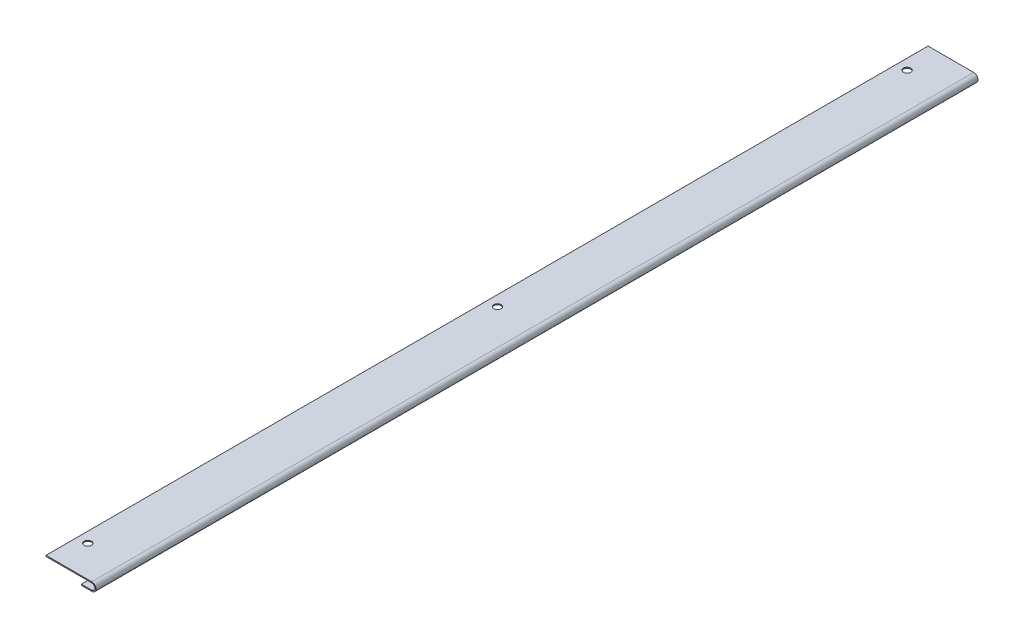
ISO-10303-21;
HEADER;
FILE_DESCRIPTION(('STEP AP214'),'2;1');
FILE_NAME('part.step','',(''),(''),'','','');
FILE_SCHEMA(('AUTOMOTIVE_DESIGN { 1 0 10303 214 1 1 1 1 }'));
ENDSEC;
DATA;
#1=APPLICATION_CONTEXT('core data for automotive mechanical design processes');
#2=APPLICATION_PROTOCOL_DEFINITION('international standard','automotive_design',2000,#1);
#3=PRODUCT_CONTEXT('',#1,'mechanical');
#4=PRODUCT('Part','Part','',(#3));
#5=PRODUCT_RELATED_PRODUCT_CATEGORY('part','',(#4));
#6=PRODUCT_DEFINITION_FORMATION('','',#4);
#7=PRODUCT_DEFINITION_CONTEXT('part definition',#1,'design');
#8=PRODUCT_DEFINITION('design','',#6,#7);
#9=PRODUCT_DEFINITION_SHAPE('','',#8);
#10=(LENGTH_UNIT() NAMED_UNIT(*) SI_UNIT(.MILLI.,.METRE.));
#11=(NAMED_UNIT(*) PLANE_ANGLE_UNIT() SI_UNIT($,.RADIAN.));
#12=(NAMED_UNIT(*) SI_UNIT($,.STERADIAN.) SOLID_ANGLE_UNIT());
#13=UNCERTAINTY_MEASURE_WITH_UNIT(LENGTH_MEASURE(1.E-05),#10,'distance_accuracy_value','');
#14=(GEOMETRIC_REPRESENTATION_CONTEXT(3) GLOBAL_UNCERTAINTY_ASSIGNED_CONTEXT((#13)) GLOBAL_UNIT_ASSIGNED_CONTEXT((#10,
#11,#12)) REPRESENTATION_CONTEXT('',''));
#15=CARTESIAN_POINT('',(0.,0.,0.));
#16=DIRECTION('',(0.,0.,1.));
#17=DIRECTION('',(1.,0.,0.));
#18=AXIS2_PLACEMENT_3D('',#15,#16,#17);
#19=CARTESIAN_POINT('',(21.9,-4.,211.));
#20=DIRECTION('',(0.,0.,1.));
#21=DIRECTION('',(1.,0.,0.));
#22=AXIS2_PLACEMENT_3D('',#19,#20,#21);
#23=PLANE('',#22);
#24=DIRECTION('',(0.,1.,0.));
#25=VECTOR('',#24,1.);
#26=CARTESIAN_POINT('',(21.9,-4.,211.));
#27=LINE('',#26,#25);
#28=CARTESIAN_POINT('',(21.9,-4.,211.));
#29=VERTEX_POINT('',#28);
#30=CARTESIAN_POINT('',(21.9,-3.5,211.));
#31=VERTEX_POINT('',#30);
#32=EDGE_CURVE('E11',#29,#31,#27,.T.);
#33=ORIENTED_EDGE('',*,*,#32,.F.);
#34=CARTESIAN_POINT('',(21.9,-2.,211.));
#35=DIRECTION('',(0.,0.,-1.));
#36=DIRECTION('',(-1.,0.,0.));
#37=AXIS2_PLACEMENT_3D('',#34,#35,#36);
#38=CIRCLE('',#37,2.);
#39=CARTESIAN_POINT('',(21.9,0.,211.));
#40=VERTEX_POINT('',#39);
#41=EDGE_CURVE('E137',#40,#29,#38,.T.);
#42=ORIENTED_EDGE('',*,*,#41,.F.);
#43=DIRECTION('',(0.,1.,0.));
#44=VECTOR('',#43,1.);
#45=CARTESIAN_POINT('',(21.9,-0.5,211.));
#46=LINE('',#45,#44);
#47=CARTESIAN_POINT('',(21.9,-0.5,211.));
#48=VERTEX_POINT('',#47);
#49=EDGE_CURVE('E47',#48,#40,#46,.T.);
#50=ORIENTED_EDGE('',*,*,#49,.F.);
#51=CARTESIAN_POINT('',(21.9,-2.,211.));
#52=DIRECTION('',(0.,0.,1.));
#53=DIRECTION('',(1.,0.,0.));
#54=AXIS2_PLACEMENT_3D('',#51,#52,#53);
#55=CIRCLE('',#54,1.5);
#56=EDGE_CURVE('E130',#48,#31,#55,.F.);
#57=ORIENTED_EDGE('',*,*,#56,.T.);
#58=EDGE_LOOP('',(#33,#42,#50,#57));
#59=FACE_BOUND('',#58,.T.);
#60=ADVANCED_FACE('F38',(#59),#23,.T.);
#61=CARTESIAN_POINT('',(21.9,-0.5,211.));
#62=DIRECTION('',(0.,0.,1.));
#63=DIRECTION('',(1.,0.,0.));
#64=AXIS2_PLACEMENT_3D('',#61,#62,#63);
#65=PLANE('',#64);
#66=DIRECTION('',(-1.,0.,0.));
#67=VECTOR('',#66,1.);
#68=CARTESIAN_POINT('',(21.9,-4.,211.));
#69=LINE('',#68,#67);
#70=CARTESIAN_POINT('',(16.9,-4.,211.));
#71=VERTEX_POINT('',#70);
#72=EDGE_CURVE('E200',#29,#71,#69,.T.);
#73=ORIENTED_EDGE('',*,*,#72,.F.);
#74=ORIENTED_EDGE('',*,*,#32,.T.);
#75=DIRECTION('',(-1.,0.,0.));
#76=VECTOR('',#75,1.);
#77=CARTESIAN_POINT('',(21.9,-3.5,211.));
#78=LINE('',#77,#76);
#79=CARTESIAN_POINT('',(16.9,-3.5,211.));
#80=VERTEX_POINT('',#79);
#81=EDGE_CURVE('E96',#31,#80,#78,.T.);
#82=ORIENTED_EDGE('',*,*,#81,.T.);
#83=DIRECTION('',(0.,1.,0.));
#84=VECTOR('',#83,1.);
#85=CARTESIAN_POINT('',(16.9,-4.,211.));
#86=LINE('',#85,#84);
#87=EDGE_CURVE('E197',#71,#80,#86,.T.);
#88=ORIENTED_EDGE('',*,*,#87,.F.);
#89=EDGE_LOOP('',(#73,#74,#82,#88));
#90=FACE_BOUND('',#89,.T.);
#91=ADVANCED_FACE('F220',(#90),#65,.T.);
#92=CARTESIAN_POINT('',(21.9,0.,-211.));
#93=DIRECTION('',(0.,0.,-1.));
#94=DIRECTION('',(-1.,0.,0.));
#95=AXIS2_PLACEMENT_3D('',#92,#93,#94);
#96=PLANE('',#95);
#97=DIRECTION('',(0.,-1.,0.));
#98=VECTOR('',#97,1.);
#99=CARTESIAN_POINT('',(21.9,0.,-211.));
#100=LINE('',#99,#98);
#101=CARTESIAN_POINT('',(21.9,0.,-211.));
#102=VERTEX_POINT('',#101);
#103=CARTESIAN_POINT('',(21.9,-0.5,-211.));
#104=VERTEX_POINT('',#103);
#105=EDGE_CURVE('E83',#102,#104,#100,.T.);
#106=ORIENTED_EDGE('',*,*,#105,.F.);
#107=CARTESIAN_POINT('',(21.9,-2.,-211.));
#108=DIRECTION('',(0.,0.,-1.));
#109=DIRECTION('',(-1.,0.,0.));
#110=AXIS2_PLACEMENT_3D('',#107,#108,#109);
#111=CIRCLE('',#110,2.);
#112=CARTESIAN_POINT('',(21.9,-4.,-211.));
#113=VERTEX_POINT('',#112);
#114=EDGE_CURVE('E153',#102,#113,#111,.T.);
#115=ORIENTED_EDGE('',*,*,#114,.T.);
#116=DIRECTION('',(0.,-1.,0.));
#117=VECTOR('',#116,1.);
#118=CARTESIAN_POINT('',(21.9,-3.5,-211.));
#119=LINE('',#118,#117);
#120=CARTESIAN_POINT('',(21.9,-3.5,-211.));
#121=VERTEX_POINT('',#120);
#122=EDGE_CURVE('E90',#121,#113,#119,.T.);
#123=ORIENTED_EDGE('',*,*,#122,.F.);
#124=CARTESIAN_POINT('',(21.9,-2.,-211.));
#125=DIRECTION('',(0.,0.,1.));
#126=DIRECTION('',(1.,0.,0.));
#127=AXIS2_PLACEMENT_3D('',#124,#125,#126);
#128=CIRCLE('',#127,1.5);
#129=EDGE_CURVE('E160',#104,#121,#128,.F.);
#130=ORIENTED_EDGE('',*,*,#129,.F.);
#131=EDGE_LOOP('',(#106,#115,#123,#130));
#132=FACE_BOUND('',#131,.T.);
#133=ADVANCED_FACE('F218',(#132),#96,.T.);
#134=CARTESIAN_POINT('',(21.9,-3.5,-211.));
#135=DIRECTION('',(0.,0.,-1.));
#136=DIRECTION('',(-1.,0.,0.));
#137=AXIS2_PLACEMENT_3D('',#134,#135,#136);
#138=PLANE('',#137);
#139=DIRECTION('',(1.,0.,0.));
#140=VECTOR('',#139,1.);
#141=CARTESIAN_POINT('',(0.,0.,-211.));
#142=LINE('',#141,#140);
#143=CARTESIAN_POINT('',(0.,0.,-211.));
#144=VERTEX_POINT('',#143);
#145=EDGE_CURVE('E155',#144,#102,#142,.T.);
#146=ORIENTED_EDGE('',*,*,#145,.T.);
#147=ORIENTED_EDGE('',*,*,#105,.T.);
#148=DIRECTION('',(1.,0.,0.));
#149=VECTOR('',#148,1.);
#150=CARTESIAN_POINT('',(0.,-0.5,-211.));
#151=LINE('',#150,#149);
#152=CARTESIAN_POINT('',(0.,-0.5,-211.));
#153=VERTEX_POINT('',#152);
#154=EDGE_CURVE('E158',#153,#104,#151,.T.);
#155=ORIENTED_EDGE('',*,*,#154,.F.);
#156=DIRECTION('',(0.,1.,0.));
#157=VECTOR('',#156,1.);
#158=CARTESIAN_POINT('',(0.,-0.5,-211.));
#159=LINE('',#158,#157);
#160=EDGE_CURVE('E118',#153,#144,#159,.T.);
#161=ORIENTED_EDGE('',*,*,#160,.T.);
#162=EDGE_LOOP('',(#146,#147,#155,#161));
#163=FACE_BOUND('',#162,.T.);
#164=ADVANCED_FACE('F214',(#163),#138,.T.);
#165=CARTESIAN_POINT('',(21.9,-3.5,211.));
#166=DIRECTION('',(0.,-1.,0.));
#167=DIRECTION('',(1.,0.,0.));
#168=AXIS2_PLACEMENT_3D('',#165,#166,#167);
#169=PLANE('',#168);
#170=DIRECTION('',(-1.,0.,0.));
#171=VECTOR('',#170,1.);
#172=CARTESIAN_POINT('',(21.9,-3.5,-211.));
#173=LINE('',#172,#171);
#174=CARTESIAN_POINT('',(16.9,-3.5,-211.));
#175=VERTEX_POINT('',#174);
#176=EDGE_CURVE('E143',#121,#175,#173,.T.);
#177=ORIENTED_EDGE('',*,*,#176,.T.);
#178=DIRECTION('',(0.,0.,-1.));
#179=VECTOR('',#178,1.);
#180=CARTESIAN_POINT('',(16.9,-3.5,211.));
#181=LINE('',#180,#179);
#182=EDGE_CURVE('E174',#80,#175,#181,.T.);
#183=ORIENTED_EDGE('',*,*,#182,.F.);
#184=ORIENTED_EDGE('',*,*,#81,.F.);
#185=DIRECTION('',(0.,0.,-1.));
#186=VECTOR('',#185,1.);
#187=CARTESIAN_POINT('',(21.9,-3.5,211.));
#188=LINE('',#187,#186);
#189=EDGE_CURVE('E142',#31,#121,#188,.T.);
#190=ORIENTED_EDGE('',*,*,#189,.T.);
#191=EDGE_LOOP('',(#177,#183,#184,#190));
#192=FACE_BOUND('',#191,.T.);
#193=ADVANCED_FACE('F226',(#192),#169,.F.);
#194=CARTESIAN_POINT('',(16.9,-4.,211.));
#195=DIRECTION('',(-1.,0.,0.));
#196=DIRECTION('',(0.,0.,1.));
#197=AXIS2_PLACEMENT_3D('',#194,#195,#196);
#198=PLANE('',#197);
#199=DIRECTION('',(0.,1.,0.));
#200=VECTOR('',#199,1.);
#201=CARTESIAN_POINT('',(16.9,-4.,-211.));
#202=LINE('',#201,#200);
#203=CARTESIAN_POINT('',(16.9,-4.,-211.));
#204=VERTEX_POINT('',#203);
#205=EDGE_CURVE('E146',#204,#175,#202,.T.);
#206=ORIENTED_EDGE('',*,*,#205,.F.);
#207=DIRECTION('',(0.,0.,-1.));
#208=VECTOR('',#207,1.);
#209=CARTESIAN_POINT('',(16.9,-4.,211.));
#210=LINE('',#209,#208);
#211=EDGE_CURVE('E172',#71,#204,#210,.T.);
#212=ORIENTED_EDGE('',*,*,#211,.F.);
#213=ORIENTED_EDGE('',*,*,#87,.T.);
#214=ORIENTED_EDGE('',*,*,#182,.T.);
#215=EDGE_LOOP('',(#206,#212,#213,#214));
#216=FACE_BOUND('',#215,.T.);
#217=ADVANCED_FACE('F257',(#216),#198,.T.);
#218=CARTESIAN_POINT('',(21.9,-4.,211.));
#219=DIRECTION('',(0.,-1.,0.));
#220=DIRECTION('',(1.,0.,0.));
#221=AXIS2_PLACEMENT_3D('',#218,#219,#220);
#222=PLANE('',#221);
#223=DIRECTION('',(-1.,0.,0.));
#224=VECTOR('',#223,1.);
#225=CARTESIAN_POINT('',(21.9,-4.,-211.));
#226=LINE('',#225,#224);
#227=EDGE_CURVE('E150',#113,#204,#226,.T.);
#228=ORIENTED_EDGE('',*,*,#227,.F.);
#229=DIRECTION('',(0.,0.,-1.));
#230=VECTOR('',#229,1.);
#231=CARTESIAN_POINT('',(21.9,-4.,211.));
#232=LINE('',#231,#230);
#233=EDGE_CURVE('E169',#29,#113,#232,.T.);
#234=ORIENTED_EDGE('',*,*,#233,.F.);
#235=ORIENTED_EDGE('',*,*,#72,.T.);
#236=ORIENTED_EDGE('',*,*,#211,.T.);
#237=EDGE_LOOP('',(#228,#234,#235,#236));
#238=FACE_BOUND('',#237,.T.);
#239=ADVANCED_FACE('F268',(#238),#222,.T.);
#240=CARTESIAN_POINT('',(21.9,-2.,211.));
#241=DIRECTION('',(0.,0.,-1.));
#242=DIRECTION('',(-1.,0.,0.));
#243=AXIS2_PLACEMENT_3D('',#240,#241,#242);
#244=CYLINDRICAL_SURFACE('',#243,2.);
#245=ORIENTED_EDGE('',*,*,#114,.F.);
#246=DIRECTION('',(0.,0.,-1.));
#247=VECTOR('',#246,1.);
#248=CARTESIAN_POINT('',(21.9,0.,211.));
#249=LINE('',#248,#247);
#250=EDGE_CURVE('E166',#40,#102,#249,.T.);
#251=ORIENTED_EDGE('',*,*,#250,.F.);
#252=ORIENTED_EDGE('',*,*,#41,.T.);
#253=ORIENTED_EDGE('',*,*,#233,.T.);
#254=EDGE_LOOP('',(#245,#251,#252,#253));
#255=FACE_BOUND('',#254,.T.);
#256=ADVANCED_FACE('F207',(#255),#244,.T.);
#257=CARTESIAN_POINT('',(0.,0.,211.));
#258=DIRECTION('',(0.,1.,0.));
#259=DIRECTION('',(0.,0.,1.));
#260=AXIS2_PLACEMENT_3D('',#257,#258,#259);
#261=PLANE('',#260);
#262=CARTESIAN_POINT('',(5.,0.,0.));
#263=DIRECTION('',(0.,1.,0.));
#264=DIRECTION('',(0.,0.,1.));
#265=AXIS2_PLACEMENT_3D('',#262,#263,#264);
#266=CIRCLE('',#265,1.74999999999999);
#267=CARTESIAN_POINT('',(5.,0.,1.74999999999999));
#268=VERTEX_POINT('',#267);
#269=EDGE_CURVE('E193',#268,#268,#266,.T.);
#270=ORIENTED_EDGE('',*,*,#269,.F.);
#271=EDGE_LOOP('',(#270));
#272=FACE_BOUND('',#271,.T.);
#273=CARTESIAN_POINT('',(5.,0.,196.));
#274=DIRECTION('',(0.,1.,0.));
#275=DIRECTION('',(0.,0.,-1.));
#276=AXIS2_PLACEMENT_3D('',#273,#274,#275);
#277=CIRCLE('',#276,1.74999999999982);
#278=CARTESIAN_POINT('',(5.,0.,194.25));
#279=VERTEX_POINT('',#278);
#280=EDGE_CURVE('E183',#279,#279,#277,.T.);
#281=ORIENTED_EDGE('',*,*,#280,.F.);
#282=EDGE_LOOP('',(#281));
#283=FACE_BOUND('',#282,.T.);
#284=CARTESIAN_POINT('',(5.,0.,-196.));
#285=DIRECTION('',(0.,1.,0.));
#286=DIRECTION('',(0.,0.,1.));
#287=AXIS2_PLACEMENT_3D('',#284,#285,#286);
#288=CIRCLE('',#287,1.74999999999982);
#289=CARTESIAN_POINT('',(5.,0.,-194.25));
#290=VERTEX_POINT('',#289);
#291=EDGE_CURVE('E180',#290,#290,#288,.T.);
#292=ORIENTED_EDGE('',*,*,#291,.F.);
#293=EDGE_LOOP('',(#292));
#294=FACE_BOUND('',#293,.T.);
#295=ORIENTED_EDGE('',*,*,#145,.F.);
#296=DIRECTION('',(0.,0.,-1.));
#297=VECTOR('',#296,1.);
#298=CARTESIAN_POINT('',(0.,0.,211.));
#299=LINE('',#298,#297);
#300=CARTESIAN_POINT('',(0.,0.,211.));
#301=VERTEX_POINT('',#300);
#302=EDGE_CURVE('E120',#301,#144,#299,.T.);
#303=ORIENTED_EDGE('',*,*,#302,.F.);
#304=DIRECTION('',(1.,0.,0.));
#305=VECTOR('',#304,1.);
#306=CARTESIAN_POINT('',(0.,0.,211.));
#307=LINE('',#306,#305);
#308=EDGE_CURVE('E135',#301,#40,#307,.T.);
#309=ORIENTED_EDGE('',*,*,#308,.T.);
#310=ORIENTED_EDGE('',*,*,#250,.T.);
#311=EDGE_LOOP('',(#295,#303,#309,#310));
#312=FACE_BOUND('',#311,.T.);
#313=ADVANCED_FACE('F213',(#272,#283,#294,#312),#261,.T.);
#314=CARTESIAN_POINT('',(0.,-0.5,211.));
#315=DIRECTION('',(-1.,0.,0.));
#316=DIRECTION('',(0.,0.,1.));
#317=AXIS2_PLACEMENT_3D('',#314,#315,#316);
#318=PLANE('',#317);
#319=ORIENTED_EDGE('',*,*,#160,.F.);
#320=DIRECTION('',(0.,0.,-1.));
#321=VECTOR('',#320,1.);
#322=CARTESIAN_POINT('',(0.,-0.5,211.));
#323=LINE('',#322,#321);
#324=CARTESIAN_POINT('',(0.,-0.5,211.));
#325=VERTEX_POINT('',#324);
#326=EDGE_CURVE('E112',#325,#153,#323,.T.);
#327=ORIENTED_EDGE('',*,*,#326,.F.);
#328=DIRECTION('',(0.,1.,0.));
#329=VECTOR('',#328,1.);
#330=CARTESIAN_POINT('',(0.,-0.5,211.));
#331=LINE('',#330,#329);
#332=EDGE_CURVE('E116',#325,#301,#331,.T.);
#333=ORIENTED_EDGE('',*,*,#332,.T.);
#334=ORIENTED_EDGE('',*,*,#302,.T.);
#335=EDGE_LOOP('',(#319,#327,#333,#334));
#336=FACE_BOUND('',#335,.T.);
#337=ADVANCED_FACE('F114',(#336),#318,.T.);
#338=CARTESIAN_POINT('',(0.,-0.5,211.));
#339=DIRECTION('',(0.,1.,0.));
#340=DIRECTION('',(0.,0.,1.));
#341=AXIS2_PLACEMENT_3D('',#338,#339,#340);
#342=PLANE('',#341);
#343=CARTESIAN_POINT('',(5.,-0.5,0.));
#344=DIRECTION('',(0.,1.,0.));
#345=DIRECTION('',(0.,0.,1.));
#346=AXIS2_PLACEMENT_3D('',#343,#344,#345);
#347=CIRCLE('',#346,1.74999999999999);
#348=CARTESIAN_POINT('',(5.,-0.5,1.74999999999999));
#349=VERTEX_POINT('',#348);
#350=EDGE_CURVE('E41',#349,#349,#347,.T.);
#351=ORIENTED_EDGE('',*,*,#350,.T.);
#352=EDGE_LOOP('',(#351));
#353=FACE_BOUND('',#352,.T.);
#354=CARTESIAN_POINT('',(5.,-0.5,196.));
#355=DIRECTION('',(0.,1.,0.));
#356=DIRECTION('',(0.,0.,1.));
#357=AXIS2_PLACEMENT_3D('',#354,#355,#356);
#358=CIRCLE('',#357,1.74999999999982);
#359=CARTESIAN_POINT('',(5.,-0.5,197.75));
#360=VERTEX_POINT('',#359);
#361=EDGE_CURVE('E181',#360,#360,#358,.T.);
#362=ORIENTED_EDGE('',*,*,#361,.T.);
#363=EDGE_LOOP('',(#362));
#364=FACE_BOUND('',#363,.T.);
#365=CARTESIAN_POINT('',(5.,-0.5,-196.));
#366=DIRECTION('',(0.,1.,0.));
#367=DIRECTION('',(0.,0.,1.));
#368=AXIS2_PLACEMENT_3D('',#365,#366,#367);
#369=CIRCLE('',#368,1.74999999999982);
#370=CARTESIAN_POINT('',(5.,-0.5,-194.25));
#371=VERTEX_POINT('',#370);
#372=EDGE_CURVE('E147',#371,#371,#369,.T.);
#373=ORIENTED_EDGE('',*,*,#372,.T.);
#374=EDGE_LOOP('',(#373));
#375=FACE_BOUND('',#374,.T.);
#376=ORIENTED_EDGE('',*,*,#154,.T.);
#377=DIRECTION('',(0.,0.,-1.));
#378=VECTOR('',#377,1.);
#379=CARTESIAN_POINT('',(21.9,-0.5,211.));
#380=LINE('',#379,#378);
#381=EDGE_CURVE('E121',#48,#104,#380,.T.);
#382=ORIENTED_EDGE('',*,*,#381,.F.);
#383=DIRECTION('',(1.,0.,0.));
#384=VECTOR('',#383,1.);
#385=CARTESIAN_POINT('',(0.,-0.5,211.));
#386=LINE('',#385,#384);
#387=EDGE_CURVE('E125',#325,#48,#386,.T.);
#388=ORIENTED_EDGE('',*,*,#387,.F.);
#389=ORIENTED_EDGE('',*,*,#326,.T.);
#390=EDGE_LOOP('',(#376,#382,#388,#389));
#391=FACE_BOUND('',#390,.T.);
#392=ADVANCED_FACE('F126',(#353,#364,#375,#391),#342,.F.);
#393=CARTESIAN_POINT('',(21.9,-2.,211.));
#394=DIRECTION('',(0.,0.,-1.));
#395=DIRECTION('',(-1.,0.,0.));
#396=AXIS2_PLACEMENT_3D('',#393,#394,#395);
#397=CYLINDRICAL_SURFACE('',#396,1.5);
#398=ORIENTED_EDGE('',*,*,#129,.T.);
#399=ORIENTED_EDGE('',*,*,#189,.F.);
#400=ORIENTED_EDGE('',*,*,#56,.F.);
#401=ORIENTED_EDGE('',*,*,#381,.T.);
#402=EDGE_LOOP('',(#398,#399,#400,#401));
#403=FACE_BOUND('',#402,.T.);
#404=ADVANCED_FACE('F216',(#403),#397,.F.);
#405=CARTESIAN_POINT('',(21.9,-2.,211.));
#406=DIRECTION('',(0.,0.,-1.));
#407=DIRECTION('',(-1.,0.,0.));
#408=AXIS2_PLACEMENT_3D('',#405,#406,#407);
#409=PLANE('',#408);
#410=ORIENTED_EDGE('',*,*,#387,.T.);
#411=ORIENTED_EDGE('',*,*,#49,.T.);
#412=ORIENTED_EDGE('',*,*,#308,.F.);
#413=ORIENTED_EDGE('',*,*,#332,.F.);
#414=EDGE_LOOP('',(#410,#411,#412,#413));
#415=FACE_BOUND('',#414,.T.);
#416=ADVANCED_FACE('F133',(#415),#409,.F.);
#417=CARTESIAN_POINT('',(21.9,-2.,-211.));
#418=DIRECTION('',(0.,0.,-1.));
#419=DIRECTION('',(-1.,0.,0.));
#420=AXIS2_PLACEMENT_3D('',#417,#418,#419);
#421=PLANE('',#420);
#422=ORIENTED_EDGE('',*,*,#176,.F.);
#423=ORIENTED_EDGE('',*,*,#122,.T.);
#424=ORIENTED_EDGE('',*,*,#227,.T.);
#425=ORIENTED_EDGE('',*,*,#205,.T.);
#426=EDGE_LOOP('',(#422,#423,#424,#425));
#427=FACE_BOUND('',#426,.T.);
#428=ADVANCED_FACE('F320',(#427),#421,.T.);
#429=CARTESIAN_POINT('',(5.,-10.,-196.));
#430=DIRECTION('',(0.,1.,0.));
#431=DIRECTION('',(0.,0.,1.));
#432=AXIS2_PLACEMENT_3D('',#429,#430,#431);
#433=CYLINDRICAL_SURFACE('',#432,1.74999999999982);
#434=ORIENTED_EDGE('',*,*,#291,.T.);
#435=EDGE_LOOP('',(#434));
#436=FACE_BOUND('',#435,.T.);
#437=ORIENTED_EDGE('',*,*,#372,.F.);
#438=EDGE_LOOP('',(#437));
#439=FACE_BOUND('',#438,.T.);
#440=ADVANCED_FACE('F330',(#436,#439),#433,.F.);
#441=CARTESIAN_POINT('',(5.,-10.,196.));
#442=DIRECTION('',(0.,1.,0.));
#443=DIRECTION('',(0.,0.,1.));
#444=AXIS2_PLACEMENT_3D('',#441,#442,#443);
#445=CYLINDRICAL_SURFACE('',#444,1.74999999999982);
#446=ORIENTED_EDGE('',*,*,#280,.T.);
#447=EDGE_LOOP('',(#446));
#448=FACE_BOUND('',#447,.T.);
#449=ORIENTED_EDGE('',*,*,#361,.F.);
#450=EDGE_LOOP('',(#449));
#451=FACE_BOUND('',#450,.T.);
#452=ADVANCED_FACE('F357',(#448,#451),#445,.F.);
#453=CARTESIAN_POINT('',(5.,-10.,0.));
#454=DIRECTION('',(0.,1.,0.));
#455=DIRECTION('',(0.,0.,1.));
#456=AXIS2_PLACEMENT_3D('',#453,#454,#455);
#457=CYLINDRICAL_SURFACE('',#456,1.74999999999999);
#458=ORIENTED_EDGE('',*,*,#269,.T.);
#459=EDGE_LOOP('',(#458));
#460=FACE_BOUND('',#459,.T.);
#461=ORIENTED_EDGE('',*,*,#350,.F.);
#462=EDGE_LOOP('',(#461));
#463=FACE_BOUND('',#462,.T.);
#464=ADVANCED_FACE('F367',(#460,#463),#457,.F.);
#465=CLOSED_SHELL('',(#60,#91,#133,#164,#193,#217,#239,#256,#313,#337,#392,#404,#416,#428,#440,
#452,#464));
#466=MANIFOLD_SOLID_BREP('B2',#465);
#467=ADVANCED_BREP_SHAPE_REPRESENTATION('',(#18,#466),#14);
#468=SHAPE_DEFINITION_REPRESENTATION(#9,#467);
ENDSEC;
END-ISO-10303-21;
